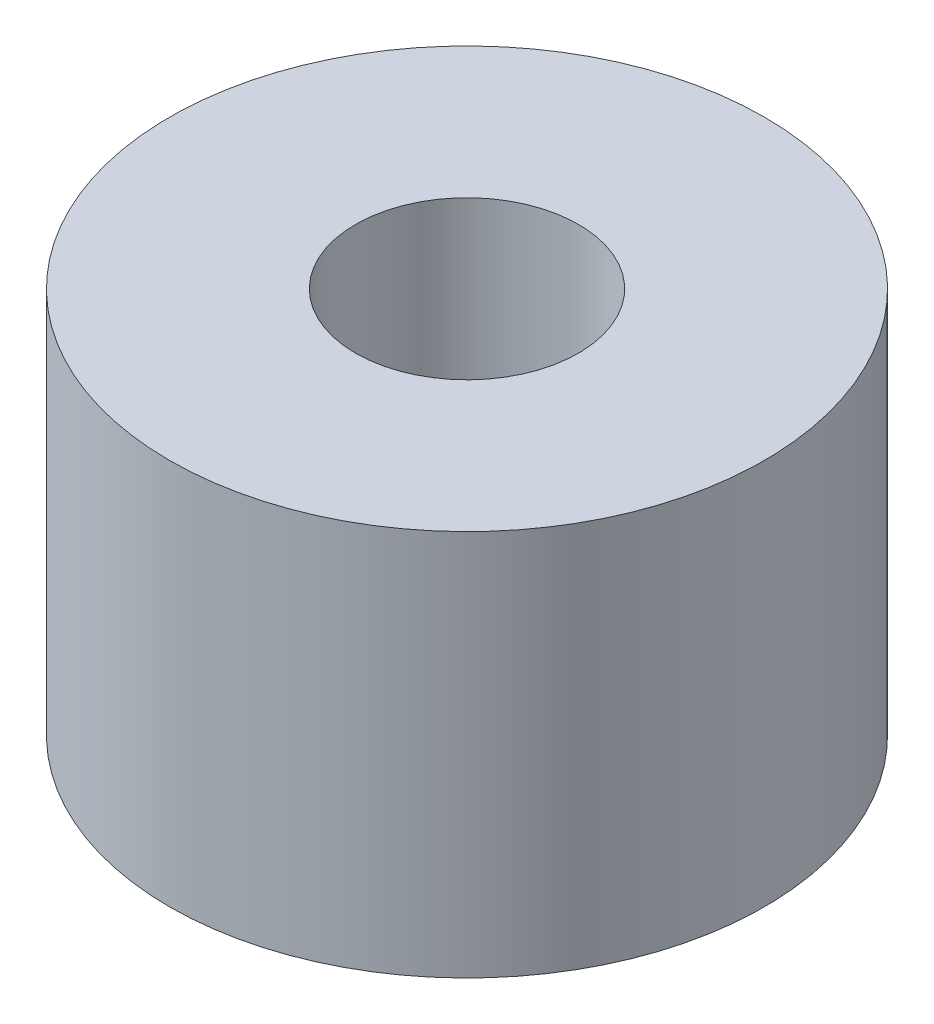
ISO-10303-21;
HEADER;
FILE_DESCRIPTION(('STEP AP214'),'2;1');
FILE_NAME('part.step','',(''),(''),'','','');
FILE_SCHEMA(('AUTOMOTIVE_DESIGN { 1 0 10303 214 1 1 1 1 }'));
ENDSEC;
DATA;
#1=APPLICATION_CONTEXT('core data for automotive mechanical design processes');
#2=APPLICATION_PROTOCOL_DEFINITION('international standard','automotive_design',2000,#1);
#3=PRODUCT_CONTEXT('',#1,'mechanical');
#4=PRODUCT('Part','Part','',(#3));
#5=PRODUCT_RELATED_PRODUCT_CATEGORY('part','',(#4));
#6=PRODUCT_DEFINITION_FORMATION('','',#4);
#7=PRODUCT_DEFINITION_CONTEXT('part definition',#1,'design');
#8=PRODUCT_DEFINITION('design','',#6,#7);
#9=PRODUCT_DEFINITION_SHAPE('','',#8);
#10=(LENGTH_UNIT() NAMED_UNIT(*) SI_UNIT(.MILLI.,.METRE.));
#11=(NAMED_UNIT(*) PLANE_ANGLE_UNIT() SI_UNIT($,.RADIAN.));
#12=(NAMED_UNIT(*) SI_UNIT($,.STERADIAN.) SOLID_ANGLE_UNIT());
#13=UNCERTAINTY_MEASURE_WITH_UNIT(LENGTH_MEASURE(1.E-05),#10,'distance_accuracy_value','');
#14=(GEOMETRIC_REPRESENTATION_CONTEXT(3) GLOBAL_UNCERTAINTY_ASSIGNED_CONTEXT((#13)) GLOBAL_UNIT_ASSIGNED_CONTEXT((#10,
#11,#12)) REPRESENTATION_CONTEXT('',''));
#15=CARTESIAN_POINT('',(0.,0.,0.));
#16=DIRECTION('',(0.,0.,1.));
#17=DIRECTION('',(1.,0.,0.));
#18=AXIS2_PLACEMENT_3D('',#15,#16,#17);
#19=CARTESIAN_POINT('',(0.,130.,0.));
#20=DIRECTION('',(0.,1.,0.));
#21=DIRECTION('',(0.,0.,1.));
#22=AXIS2_PLACEMENT_3D('',#19,#20,#21);
#23=PLANE('',#22);
#24=CARTESIAN_POINT('',(0.,130.,0.));
#25=DIRECTION('',(0.,1.,0.));
#26=DIRECTION('',(0.,0.,1.));
#27=AXIS2_PLACEMENT_3D('',#24,#25,#26);
#28=CIRCLE('',#27,100.);
#29=CARTESIAN_POINT('',(0.,130.,100.));
#30=VERTEX_POINT('',#29);
#31=EDGE_CURVE('E10',#30,#30,#28,.T.);
#32=ORIENTED_EDGE('',*,*,#31,.T.);
#33=EDGE_LOOP('',(#32));
#34=FACE_BOUND('',#33,.T.);
#35=CARTESIAN_POINT('',(0.,130.,0.));
#36=DIRECTION('',(0.,1.,0.));
#37=DIRECTION('',(0.,0.,1.));
#38=AXIS2_PLACEMENT_3D('',#35,#36,#37);
#39=CIRCLE('',#38,37.5);
#40=CARTESIAN_POINT('',(0.,130.,37.5));
#41=VERTEX_POINT('',#40);
#42=EDGE_CURVE('E42',#41,#41,#39,.T.);
#43=ORIENTED_EDGE('',*,*,#42,.F.);
#44=EDGE_LOOP('',(#43));
#45=FACE_BOUND('',#44,.T.);
#46=ADVANCED_FACE('F31',(#34,#45),#23,.T.);
#47=CARTESIAN_POINT('',(0.,0.,0.));
#48=DIRECTION('',(0.,1.,0.));
#49=DIRECTION('',(0.,0.,1.));
#50=AXIS2_PLACEMENT_3D('',#47,#48,#49);
#51=PLANE('',#50);
#52=CARTESIAN_POINT('',(0.,0.,0.));
#53=DIRECTION('',(0.,1.,0.));
#54=DIRECTION('',(0.,0.,1.));
#55=AXIS2_PLACEMENT_3D('',#52,#53,#54);
#56=CIRCLE('',#55,100.);
#57=CARTESIAN_POINT('',(0.,0.,100.));
#58=VERTEX_POINT('',#57);
#59=EDGE_CURVE('E35',#58,#58,#56,.T.);
#60=ORIENTED_EDGE('',*,*,#59,.F.);
#61=EDGE_LOOP('',(#60));
#62=FACE_BOUND('',#61,.T.);
#63=CARTESIAN_POINT('',(0.,0.,0.));
#64=DIRECTION('',(0.,1.,0.));
#65=DIRECTION('',(0.,0.,1.));
#66=AXIS2_PLACEMENT_3D('',#63,#64,#65);
#67=CIRCLE('',#66,37.5);
#68=CARTESIAN_POINT('',(0.,0.,37.5));
#69=VERTEX_POINT('',#68);
#70=EDGE_CURVE('E44',#69,#69,#67,.T.);
#71=ORIENTED_EDGE('',*,*,#70,.T.);
#72=EDGE_LOOP('',(#71));
#73=FACE_BOUND('',#72,.T.);
#74=ADVANCED_FACE('F54',(#62,#73),#51,.F.);
#75=CARTESIAN_POINT('',(0.,130.,0.));
#76=DIRECTION('',(0.,-1.,0.));
#77=DIRECTION('',(0.,0.,-1.));
#78=AXIS2_PLACEMENT_3D('',#75,#76,#77);
#79=CYLINDRICAL_SURFACE('',#78,100.);
#80=ORIENTED_EDGE('',*,*,#31,.F.);
#81=EDGE_LOOP('',(#80));
#82=FACE_BOUND('',#81,.T.);
#83=ORIENTED_EDGE('',*,*,#59,.T.);
#84=EDGE_LOOP('',(#83));
#85=FACE_BOUND('',#84,.T.);
#86=ADVANCED_FACE('F33',(#82,#85),#79,.T.);
#87=CARTESIAN_POINT('',(0.,130.,0.));
#88=DIRECTION('',(0.,-1.,0.));
#89=DIRECTION('',(0.,0.,-1.));
#90=AXIS2_PLACEMENT_3D('',#87,#88,#89);
#91=CYLINDRICAL_SURFACE('',#90,37.5);
#92=ORIENTED_EDGE('',*,*,#42,.T.);
#93=EDGE_LOOP('',(#92));
#94=FACE_BOUND('',#93,.T.);
#95=ORIENTED_EDGE('',*,*,#70,.F.);
#96=EDGE_LOOP('',(#95));
#97=FACE_BOUND('',#96,.T.);
#98=ADVANCED_FACE('F50',(#94,#97),#91,.F.);
#99=CLOSED_SHELL('',(#46,#74,#86,#98));
#100=MANIFOLD_SOLID_BREP('B2',#99);
#101=ADVANCED_BREP_SHAPE_REPRESENTATION('',(#18,#100),#14);
#102=SHAPE_DEFINITION_REPRESENTATION(#9,#101);
ENDSEC;
END-ISO-10303-21;
